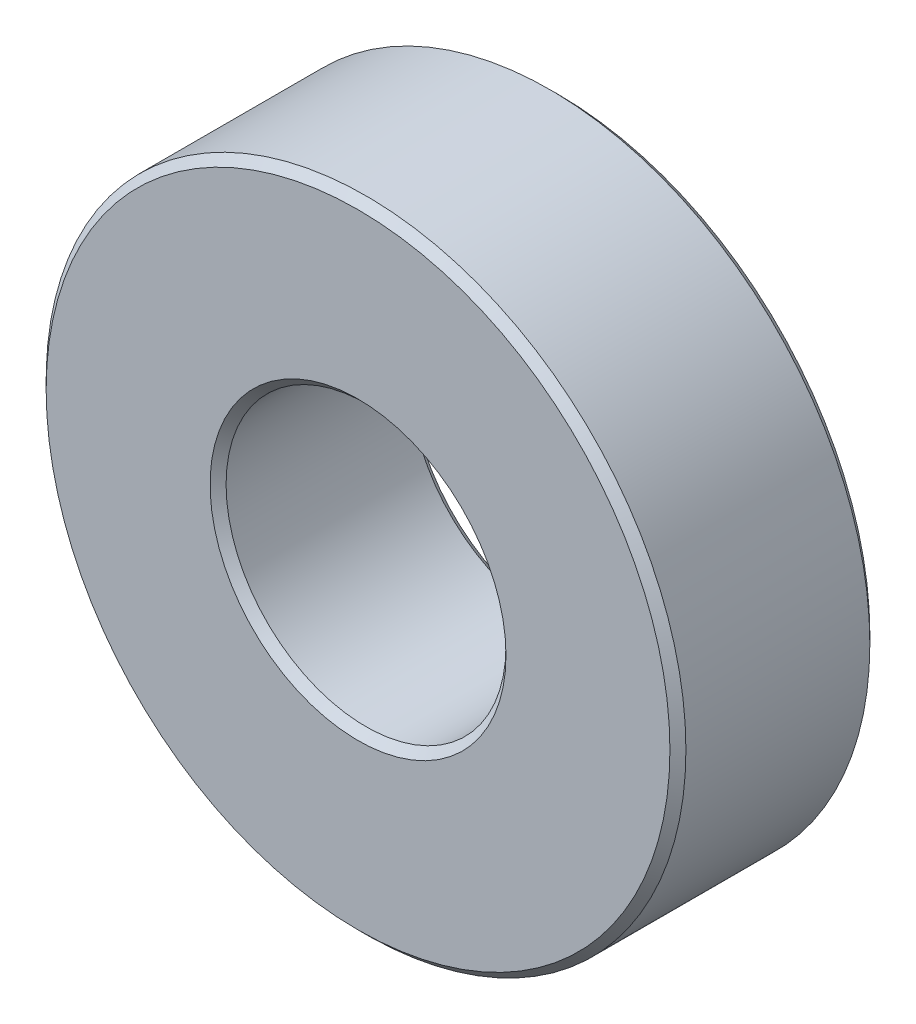
ISO-10303-21;
HEADER;
FILE_DESCRIPTION(('STEP AP214'),'2;1');
FILE_NAME('part.step','',(''),(''),'','','');
FILE_SCHEMA(('AUTOMOTIVE_DESIGN { 1 0 10303 214 1 1 1 1 }'));
ENDSEC;
DATA;
#1=APPLICATION_CONTEXT('core data for automotive mechanical design processes');
#2=APPLICATION_PROTOCOL_DEFINITION('international standard','automotive_design',2000,#1);
#3=PRODUCT_CONTEXT('',#1,'mechanical');
#4=PRODUCT('Part','Part','',(#3));
#5=PRODUCT_RELATED_PRODUCT_CATEGORY('part','',(#4));
#6=PRODUCT_DEFINITION_FORMATION('','',#4);
#7=PRODUCT_DEFINITION_CONTEXT('part definition',#1,'design');
#8=PRODUCT_DEFINITION('design','',#6,#7);
#9=PRODUCT_DEFINITION_SHAPE('','',#8);
#10=(LENGTH_UNIT() NAMED_UNIT(*) SI_UNIT(.MILLI.,.METRE.));
#11=(NAMED_UNIT(*) PLANE_ANGLE_UNIT() SI_UNIT($,.RADIAN.));
#12=(NAMED_UNIT(*) SI_UNIT($,.STERADIAN.) SOLID_ANGLE_UNIT());
#13=UNCERTAINTY_MEASURE_WITH_UNIT(LENGTH_MEASURE(1.E-05),#10,'distance_accuracy_value','');
#14=(GEOMETRIC_REPRESENTATION_CONTEXT(3) GLOBAL_UNCERTAINTY_ASSIGNED_CONTEXT((#13)) GLOBAL_UNIT_ASSIGNED_CONTEXT((#10,
#11,#12)) REPRESENTATION_CONTEXT('',''));
#15=CARTESIAN_POINT('',(0.,0.,0.));
#16=DIRECTION('',(0.,0.,1.));
#17=DIRECTION('',(1.,0.,0.));
#18=AXIS2_PLACEMENT_3D('',#15,#16,#17);
#19=CARTESIAN_POINT('',(0.,0.,5.));
#20=DIRECTION('',(0.,0.,1.));
#21=DIRECTION('',(1.,0.,0.));
#22=AXIS2_PLACEMENT_3D('',#19,#20,#21);
#23=PLANE('',#22);
#24=CARTESIAN_POINT('',(0.,0.,5.));
#25=DIRECTION('',(0.,0.,1.));
#26=DIRECTION('',(1.,0.,0.));
#27=AXIS2_PLACEMENT_3D('',#24,#25,#26);
#28=CIRCLE('',#27,3.7);
#29=CARTESIAN_POINT('',(3.7,0.,5.));
#30=VERTEX_POINT('',#29);
#31=EDGE_CURVE('E42',#30,#30,#28,.F.);
#32=ORIENTED_EDGE('',*,*,#31,.T.);
#33=EDGE_LOOP('',(#32));
#34=FACE_BOUND('',#33,.T.);
#35=CARTESIAN_POINT('',(0.,0.,5.));
#36=DIRECTION('',(0.,0.,1.));
#37=DIRECTION('',(1.,0.,0.));
#38=AXIS2_PLACEMENT_3D('',#35,#36,#37);
#39=CIRCLE('',#38,7.8);
#40=CARTESIAN_POINT('',(7.8,0.,5.));
#41=VERTEX_POINT('',#40);
#42=EDGE_CURVE('E46',#41,#41,#39,.T.);
#43=ORIENTED_EDGE('',*,*,#42,.T.);
#44=EDGE_LOOP('',(#43));
#45=FACE_BOUND('',#44,.T.);
#46=ADVANCED_FACE('F31',(#34,#45),#23,.T.);
#47=CARTESIAN_POINT('',(0.,0.,0.));
#48=DIRECTION('',(0.,0.,1.));
#49=DIRECTION('',(1.,0.,0.));
#50=AXIS2_PLACEMENT_3D('',#47,#48,#49);
#51=PLANE('',#50);
#52=CARTESIAN_POINT('',(0.,0.,0.));
#53=DIRECTION('',(0.,0.,1.));
#54=DIRECTION('',(1.,0.,0.));
#55=AXIS2_PLACEMENT_3D('',#52,#53,#54);
#56=CIRCLE('',#55,3.7);
#57=CARTESIAN_POINT('',(3.7,0.,0.));
#58=VERTEX_POINT('',#57);
#59=EDGE_CURVE('E57',#58,#58,#56,.T.);
#60=ORIENTED_EDGE('',*,*,#59,.T.);
#61=EDGE_LOOP('',(#60));
#62=FACE_BOUND('',#61,.T.);
#63=CARTESIAN_POINT('',(0.,0.,0.));
#64=DIRECTION('',(0.,0.,1.));
#65=DIRECTION('',(1.,0.,0.));
#66=AXIS2_PLACEMENT_3D('',#63,#64,#65);
#67=CIRCLE('',#66,7.8);
#68=CARTESIAN_POINT('',(7.8,0.,0.));
#69=VERTEX_POINT('',#68);
#70=EDGE_CURVE('E60',#69,#69,#67,.F.);
#71=ORIENTED_EDGE('',*,*,#70,.T.);
#72=EDGE_LOOP('',(#71));
#73=FACE_BOUND('',#72,.T.);
#74=ADVANCED_FACE('F64',(#62,#73),#51,.F.);
#75=CARTESIAN_POINT('',(0.,0.,5.));
#76=DIRECTION('',(0.,0.,-1.));
#77=DIRECTION('',(-1.,0.,0.));
#78=AXIS2_PLACEMENT_3D('',#75,#76,#77);
#79=CYLINDRICAL_SURFACE('',#78,8.);
#80=CARTESIAN_POINT('',(0.,0.,0.200000000000003));
#81=DIRECTION('',(0.,0.,1.));
#82=DIRECTION('',(1.,0.,0.));
#83=AXIS2_PLACEMENT_3D('',#80,#81,#82);
#84=CIRCLE('',#83,8.);
#85=CARTESIAN_POINT('',(8.,0.,0.200000000000003));
#86=VERTEX_POINT('',#85);
#87=EDGE_CURVE('E10',#86,#86,#84,.T.);
#88=ORIENTED_EDGE('',*,*,#87,.T.);
#89=EDGE_LOOP('',(#88));
#90=FACE_BOUND('',#89,.T.);
#91=CARTESIAN_POINT('',(0.,0.,4.8));
#92=DIRECTION('',(0.,0.,1.));
#93=DIRECTION('',(1.,0.,0.));
#94=AXIS2_PLACEMENT_3D('',#91,#92,#93);
#95=CIRCLE('',#94,8.);
#96=CARTESIAN_POINT('',(8.,0.,4.8));
#97=VERTEX_POINT('',#96);
#98=EDGE_CURVE('E38',#97,#97,#95,.F.);
#99=ORIENTED_EDGE('',*,*,#98,.T.);
#100=EDGE_LOOP('',(#99));
#101=FACE_BOUND('',#100,.T.);
#102=ADVANCED_FACE('F33',(#90,#101),#79,.T.);
#103=CARTESIAN_POINT('',(0.,0.,5.));
#104=DIRECTION('',(0.,0.,-1.));
#105=DIRECTION('',(-1.,0.,0.));
#106=AXIS2_PLACEMENT_3D('',#103,#104,#105);
#107=CYLINDRICAL_SURFACE('',#106,3.5);
#108=CARTESIAN_POINT('',(0.,0.,0.200000000000001));
#109=DIRECTION('',(0.,0.,1.));
#110=DIRECTION('',(1.,0.,0.));
#111=AXIS2_PLACEMENT_3D('',#108,#109,#110);
#112=CIRCLE('',#111,3.5);
#113=CARTESIAN_POINT('',(3.5,0.,0.200000000000001));
#114=VERTEX_POINT('',#113);
#115=EDGE_CURVE('E51',#114,#114,#112,.F.);
#116=ORIENTED_EDGE('',*,*,#115,.T.);
#117=EDGE_LOOP('',(#116));
#118=FACE_BOUND('',#117,.T.);
#119=CARTESIAN_POINT('',(0.,0.,4.8));
#120=DIRECTION('',(0.,0.,1.));
#121=DIRECTION('',(1.,0.,0.));
#122=AXIS2_PLACEMENT_3D('',#119,#120,#121);
#123=CIRCLE('',#122,3.5);
#124=CARTESIAN_POINT('',(3.5,0.,4.8));
#125=VERTEX_POINT('',#124);
#126=EDGE_CURVE('E54',#125,#125,#123,.T.);
#127=ORIENTED_EDGE('',*,*,#126,.T.);
#128=EDGE_LOOP('',(#127));
#129=FACE_BOUND('',#128,.T.);
#130=ADVANCED_FACE('F90',(#118,#129),#107,.F.);
#131=CARTESIAN_POINT('',(0.,0.,0.));
#132=DIRECTION('',(0.,0.,-1.));
#133=DIRECTION('',(-1.,0.,0.));
#134=AXIS2_PLACEMENT_3D('',#131,#132,#133);
#135=CONICAL_SURFACE('',#134,3.7,0.785398163397454);
#136=ORIENTED_EDGE('',*,*,#115,.F.);
#137=EDGE_LOOP('',(#136));
#138=FACE_BOUND('',#137,.T.);
#139=ORIENTED_EDGE('',*,*,#59,.F.);
#140=EDGE_LOOP('',(#139));
#141=FACE_BOUND('',#140,.T.);
#142=ADVANCED_FACE('F78',(#138,#141),#135,.F.);
#143=CARTESIAN_POINT('',(0.,0.,4.8));
#144=DIRECTION('',(0.,0.,1.));
#145=DIRECTION('',(1.,0.,0.));
#146=AXIS2_PLACEMENT_3D('',#143,#144,#145);
#147=CONICAL_SURFACE('',#146,3.5,0.785398163397444);
#148=ORIENTED_EDGE('',*,*,#31,.F.);
#149=EDGE_LOOP('',(#148));
#150=FACE_BOUND('',#149,.T.);
#151=ORIENTED_EDGE('',*,*,#126,.F.);
#152=EDGE_LOOP('',(#151));
#153=FACE_BOUND('',#152,.T.);
#154=ADVANCED_FACE('F70',(#150,#153),#147,.F.);
#155=CARTESIAN_POINT('',(0.,0.,0.200000000000003));
#156=DIRECTION('',(0.,0.,1.));
#157=DIRECTION('',(1.,0.,0.));
#158=AXIS2_PLACEMENT_3D('',#155,#156,#157);
#159=CONICAL_SURFACE('',#158,8.,0.785398163397444);
#160=ORIENTED_EDGE('',*,*,#70,.F.);
#161=EDGE_LOOP('',(#160));
#162=FACE_BOUND('',#161,.T.);
#163=ORIENTED_EDGE('',*,*,#87,.F.);
#164=EDGE_LOOP('',(#163));
#165=FACE_BOUND('',#164,.T.);
#166=ADVANCED_FACE('F66',(#162,#165),#159,.T.);
#167=CARTESIAN_POINT('',(0.,0.,5.));
#168=DIRECTION('',(0.,0.,-1.));
#169=DIRECTION('',(-1.,0.,0.));
#170=AXIS2_PLACEMENT_3D('',#167,#168,#169);
#171=CONICAL_SURFACE('',#170,7.8,0.785398163397453);
#172=ORIENTED_EDGE('',*,*,#98,.F.);
#173=EDGE_LOOP('',(#172));
#174=FACE_BOUND('',#173,.T.);
#175=ORIENTED_EDGE('',*,*,#42,.F.);
#176=EDGE_LOOP('',(#175));
#177=FACE_BOUND('',#176,.T.);
#178=ADVANCED_FACE('F69',(#174,#177),#171,.T.);
#179=CLOSED_SHELL('',(#46,#74,#102,#130,#142,#154,#166,#178));
#180=MANIFOLD_SOLID_BREP('B2',#179);
#181=ADVANCED_BREP_SHAPE_REPRESENTATION('',(#18,#180),#14);
#182=SHAPE_DEFINITION_REPRESENTATION(#9,#181);
ENDSEC;
END-ISO-10303-21;
